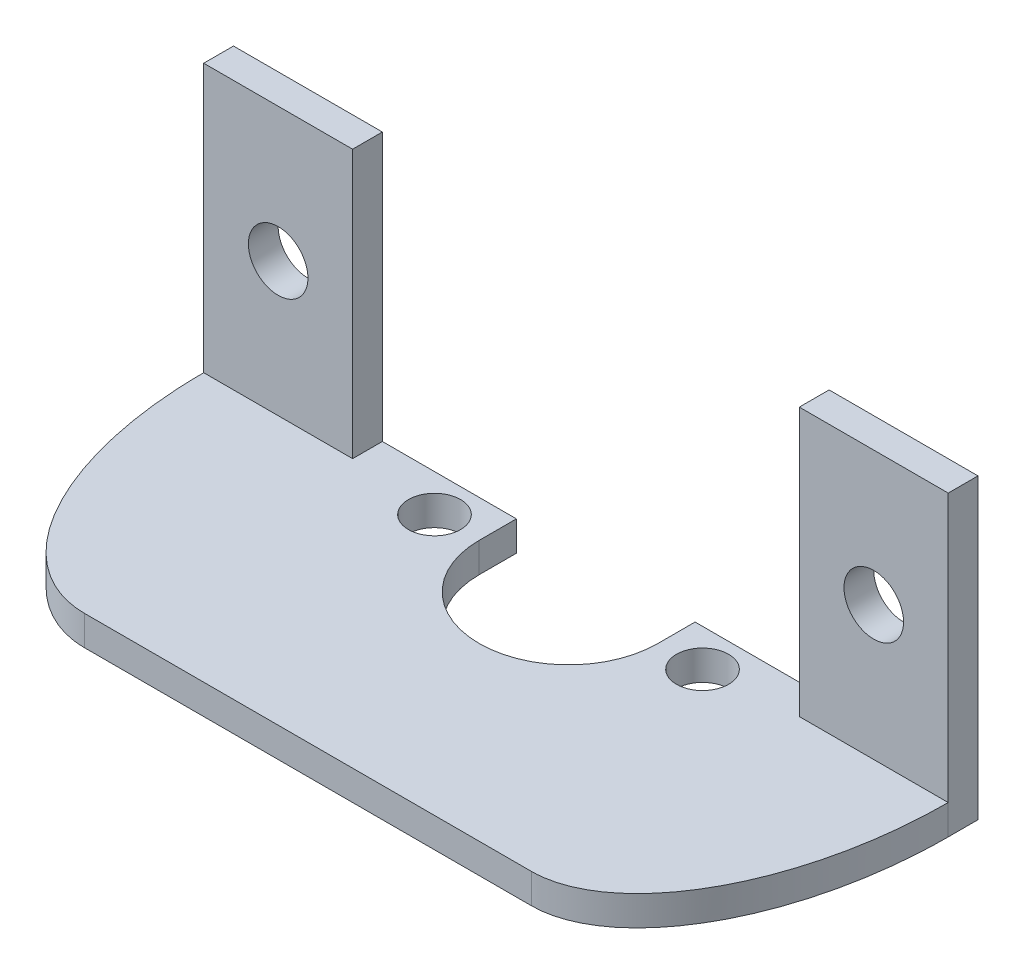
ISO-10303-21;
HEADER;
FILE_DESCRIPTION(('STEP AP214'),'2;1');
FILE_NAME('part.step','',(''),(''),'','','');
FILE_SCHEMA(('AUTOMOTIVE_DESIGN { 1 0 10303 214 1 1 1 1 }'));
ENDSEC;
DATA;
#1=APPLICATION_CONTEXT('core data for automotive mechanical design processes');
#2=APPLICATION_PROTOCOL_DEFINITION('international standard','automotive_design',2000,#1);
#3=PRODUCT_CONTEXT('',#1,'mechanical');
#4=PRODUCT('Part','Part','',(#3));
#5=PRODUCT_RELATED_PRODUCT_CATEGORY('part','',(#4));
#6=PRODUCT_DEFINITION_FORMATION('','',#4);
#7=PRODUCT_DEFINITION_CONTEXT('part definition',#1,'design');
#8=PRODUCT_DEFINITION('design','',#6,#7);
#9=PRODUCT_DEFINITION_SHAPE('','',#8);
#10=(LENGTH_UNIT() NAMED_UNIT(*) SI_UNIT(.MILLI.,.METRE.));
#11=(NAMED_UNIT(*) PLANE_ANGLE_UNIT() SI_UNIT($,.RADIAN.));
#12=(NAMED_UNIT(*) SI_UNIT($,.STERADIAN.) SOLID_ANGLE_UNIT());
#13=UNCERTAINTY_MEASURE_WITH_UNIT(LENGTH_MEASURE(1.E-05),#10,'distance_accuracy_value','');
#14=(GEOMETRIC_REPRESENTATION_CONTEXT(3) GLOBAL_UNCERTAINTY_ASSIGNED_CONTEXT((#13)) GLOBAL_UNIT_ASSIGNED_CONTEXT((#10,
#11,#12)) REPRESENTATION_CONTEXT('',''));
#15=CARTESIAN_POINT('',(0.,0.,0.));
#16=DIRECTION('',(0.,0.,1.));
#17=DIRECTION('',(1.,0.,0.));
#18=AXIS2_PLACEMENT_3D('',#15,#16,#17);
#19=CARTESIAN_POINT('',(-25.,2.,-10.));
#20=DIRECTION('',(0.,0.,1.));
#21=DIRECTION('',(1.,0.,0.));
#22=AXIS2_PLACEMENT_3D('',#19,#20,#21);
#23=PLANE('',#22);
#24=CARTESIAN_POINT('',(-20.,11.,-10.));
#25=DIRECTION('',(0.,0.,1.));
#26=DIRECTION('',(1.,0.,0.));
#27=AXIS2_PLACEMENT_3D('',#24,#25,#26);
#28=CIRCLE('',#27,2.);
#29=CARTESIAN_POINT('',(-18.,11.,-10.));
#30=VERTEX_POINT('',#29);
#31=EDGE_CURVE('E469',#30,#30,#28,.T.);
#32=ORIENTED_EDGE('',*,*,#31,.T.);
#33=EDGE_LOOP('',(#32));
#34=FACE_BOUND('',#33,.T.);
#35=DIRECTION('',(-1.,0.,0.));
#36=VECTOR('',#35,1.);
#37=CARTESIAN_POINT('',(-25.,2.,-10.));
#38=LINE('',#37,#36);
#39=CARTESIAN_POINT('',(-6.,2.,-10.));
#40=VERTEX_POINT('',#39);
#41=CARTESIAN_POINT('',(-15.,2.,-10.));
#42=VERTEX_POINT('',#41);
#43=EDGE_CURVE('E237',#40,#42,#38,.T.);
#44=ORIENTED_EDGE('',*,*,#43,.F.);
#45=DIRECTION('',(0.,1.,0.));
#46=VECTOR('',#45,1.);
#47=CARTESIAN_POINT('',(-6.,-0.0899999999999998,-10.));
#48=LINE('',#47,#46);
#49=CARTESIAN_POINT('',(-6.,0.,-10.));
#50=VERTEX_POINT('',#49);
#51=EDGE_CURVE('E194',#50,#40,#48,.T.);
#52=ORIENTED_EDGE('',*,*,#51,.F.);
#53=DIRECTION('',(-1.,0.,0.));
#54=VECTOR('',#53,1.);
#55=CARTESIAN_POINT('',(-25.,0.,-10.));
#56=LINE('',#55,#54);
#57=CARTESIAN_POINT('',(-25.,0.,-10.));
#58=VERTEX_POINT('',#57);
#59=EDGE_CURVE('E408',#50,#58,#56,.T.);
#60=ORIENTED_EDGE('',*,*,#59,.T.);
#61=DIRECTION('',(0.,-1.,0.));
#62=VECTOR('',#61,1.);
#63=CARTESIAN_POINT('',(-25.,2.,-10.));
#64=LINE('',#63,#62);
#65=CARTESIAN_POINT('',(-25.,20.,-10.));
#66=VERTEX_POINT('',#65);
#67=EDGE_CURVE('E245',#66,#58,#64,.T.);
#68=ORIENTED_EDGE('',*,*,#67,.F.);
#69=DIRECTION('',(-1.,0.,0.));
#70=VECTOR('',#69,1.);
#71=CARTESIAN_POINT('',(-25.,20.,-10.));
#72=LINE('',#71,#70);
#73=CARTESIAN_POINT('',(-15.,20.,-10.));
#74=VERTEX_POINT('',#73);
#75=EDGE_CURVE('E223',#74,#66,#72,.T.);
#76=ORIENTED_EDGE('',*,*,#75,.F.);
#77=DIRECTION('',(0.,-1.,0.));
#78=VECTOR('',#77,1.);
#79=CARTESIAN_POINT('',(-15.,20.,-10.));
#80=LINE('',#79,#78);
#81=EDGE_CURVE('E226',#74,#42,#80,.T.);
#82=ORIENTED_EDGE('',*,*,#81,.T.);
#83=EDGE_LOOP('',(#44,#52,#60,#68,#76,#82));
#84=FACE_BOUND('',#83,.T.);
#85=ADVANCED_FACE('F50',(#34,#84),#23,.F.);
#86=CARTESIAN_POINT('',(0.,2.,0.));
#87=DIRECTION('',(0.,1.,0.));
#88=DIRECTION('',(0.,0.,1.));
#89=AXIS2_PLACEMENT_3D('',#86,#87,#88);
#90=PLANE('',#89);
#91=CARTESIAN_POINT('',(-9.,2.,-7.5));
#92=DIRECTION('',(0.,1.,0.));
#93=DIRECTION('',(0.,0.,1.));
#94=AXIS2_PLACEMENT_3D('',#91,#92,#93);
#95=CIRCLE('',#94,1.75);
#96=CARTESIAN_POINT('',(-9.,2.,-5.75));
#97=VERTEX_POINT('',#96);
#98=EDGE_CURVE('E459',#97,#97,#95,.T.);
#99=ORIENTED_EDGE('',*,*,#98,.F.);
#100=EDGE_LOOP('',(#99));
#101=FACE_BOUND('',#100,.T.);
#102=CARTESIAN_POINT('',(9.,2.,-7.5));
#103=DIRECTION('',(0.,1.,0.));
#104=DIRECTION('',(0.,0.,1.));
#105=AXIS2_PLACEMENT_3D('',#102,#103,#104);
#106=CIRCLE('',#105,1.75);
#107=CARTESIAN_POINT('',(9.,2.,-5.75));
#108=VERTEX_POINT('',#107);
#109=EDGE_CURVE('E464',#108,#108,#106,.T.);
#110=ORIENTED_EDGE('',*,*,#109,.F.);
#111=EDGE_LOOP('',(#110));
#112=FACE_BOUND('',#111,.T.);
#113=DIRECTION('',(0.,0.,1.));
#114=VECTOR('',#113,1.);
#115=CARTESIAN_POINT('',(-6.,2.,-7.5));
#116=LINE('',#115,#114);
#117=CARTESIAN_POINT('',(-6.,2.,-7.5));
#118=VERTEX_POINT('',#117);
#119=EDGE_CURVE('E172',#40,#118,#116,.T.);
#120=ORIENTED_EDGE('',*,*,#119,.F.);
#121=ORIENTED_EDGE('',*,*,#43,.T.);
#122=DIRECTION('',(0.,0.,-1.));
#123=VECTOR('',#122,1.);
#124=CARTESIAN_POINT('',(-15.,2.,-10.));
#125=LINE('',#124,#123);
#126=CARTESIAN_POINT('',(-15.,2.,-8.));
#127=VERTEX_POINT('',#126);
#128=EDGE_CURVE('E219',#127,#42,#125,.T.);
#129=ORIENTED_EDGE('',*,*,#128,.F.);
#130=DIRECTION('',(1.,0.,0.));
#131=VECTOR('',#130,1.);
#132=CARTESIAN_POINT('',(-25.,2.,-8.));
#133=LINE('',#132,#131);
#134=CARTESIAN_POINT('',(-25.,2.,-8.));
#135=VERTEX_POINT('',#134);
#136=EDGE_CURVE('E204',#135,#127,#133,.T.);
#137=ORIENTED_EDGE('',*,*,#136,.F.);
#138=CARTESIAN_POINT('',(-15.,2.,10.));
#139=CARTESIAN_POINT('',(-25.,2.,10.));
#140=CARTESIAN_POINT('',(-25.,2.,-7.99999999999999));
#141=(BOUNDED_CURVE() B_SPLINE_CURVE(2,(#138,#139,#140),.UNSPECIFIED.,.F.,
.F.) B_SPLINE_CURVE_WITH_KNOTS((3,3),(0.,1.),
.UNSPECIFIED.) CURVE() GEOMETRIC_REPRESENTATION_ITEM() RATIONAL_B_SPLINE_CURVE((1.,
0.707106781186548,1.)) REPRESENTATION_ITEM(''));
#142=CARTESIAN_POINT('',(-15.,2.,10.));
#143=VERTEX_POINT('',#142);
#144=EDGE_CURVE('E496',#135,#143,#141,.F.);
#145=ORIENTED_EDGE('',*,*,#144,.T.);
#146=DIRECTION('',(1.,0.,0.));
#147=VECTOR('',#146,1.);
#148=CARTESIAN_POINT('',(-25.,2.,10.));
#149=LINE('',#148,#147);
#150=CARTESIAN_POINT('',(15.,2.,10.));
#151=VERTEX_POINT('',#150);
#152=EDGE_CURVE('E236',#143,#151,#149,.T.);
#153=ORIENTED_EDGE('',*,*,#152,.T.);
#154=CARTESIAN_POINT('',(25.,2.,-8.));
#155=CARTESIAN_POINT('',(25.,2.,10.));
#156=CARTESIAN_POINT('',(15.,2.,10.));
#157=(BOUNDED_CURVE() B_SPLINE_CURVE(2,(#154,#155,#156),.UNSPECIFIED.,.F.,
.F.) B_SPLINE_CURVE_WITH_KNOTS((3,3),(0.,1.),
.UNSPECIFIED.) CURVE() GEOMETRIC_REPRESENTATION_ITEM() RATIONAL_B_SPLINE_CURVE((1.,
0.707106781186547,1.)) REPRESENTATION_ITEM(''));
#158=CARTESIAN_POINT('',(25.,2.,-8.));
#159=VERTEX_POINT('',#158);
#160=EDGE_CURVE('E291',#151,#159,#157,.F.);
#161=ORIENTED_EDGE('',*,*,#160,.T.);
#162=DIRECTION('',(1.,0.,0.));
#163=VECTOR('',#162,1.);
#164=CARTESIAN_POINT('',(25.,2.,-8.));
#165=LINE('',#164,#163);
#166=CARTESIAN_POINT('',(15.,2.,-8.));
#167=VERTEX_POINT('',#166);
#168=EDGE_CURVE('E205',#167,#159,#165,.T.);
#169=ORIENTED_EDGE('',*,*,#168,.F.);
#170=DIRECTION('',(0.,0.,1.));
#171=VECTOR('',#170,1.);
#172=CARTESIAN_POINT('',(15.,2.,-9.99999999999999));
#173=LINE('',#172,#171);
#174=CARTESIAN_POINT('',(15.,2.,-9.99999999999999));
#175=VERTEX_POINT('',#174);
#176=EDGE_CURVE('E201',#175,#167,#173,.T.);
#177=ORIENTED_EDGE('',*,*,#176,.F.);
#178=CARTESIAN_POINT('',(6.,2.,-10.));
#179=VERTEX_POINT('',#178);
#180=EDGE_CURVE('E187',#175,#179,#38,.T.);
#181=ORIENTED_EDGE('',*,*,#180,.T.);
#182=DIRECTION('',(0.,0.,-1.));
#183=VECTOR('',#182,1.);
#184=CARTESIAN_POINT('',(6.,2.,-10.));
#185=LINE('',#184,#183);
#186=CARTESIAN_POINT('',(6.,2.,-7.5));
#187=VERTEX_POINT('',#186);
#188=EDGE_CURVE('E168',#187,#179,#185,.T.);
#189=ORIENTED_EDGE('',*,*,#188,.F.);
#190=CARTESIAN_POINT('',(0.,2.,-7.5));
#191=DIRECTION('',(0.,1.,0.));
#192=DIRECTION('',(0.,0.,1.));
#193=AXIS2_PLACEMENT_3D('',#190,#191,#192);
#194=CIRCLE('',#193,6.);
#195=EDGE_CURVE('E175',#118,#187,#194,.T.);
#196=ORIENTED_EDGE('',*,*,#195,.F.);
#197=EDGE_LOOP('',(#120,#121,#129,#137,#145,#153,#161,#169,#177,#181,#189,#196));
#198=FACE_BOUND('',#197,.T.);
#199=ADVANCED_FACE('F184',(#101,#112,#198),#90,.T.);
#200=CARTESIAN_POINT('',(25.,2.,-10.));
#201=DIRECTION('',(-1.,0.,0.));
#202=DIRECTION('',(0.,0.,1.));
#203=AXIS2_PLACEMENT_3D('',#200,#201,#202);
#204=PLANE('',#203);
#205=DIRECTION('',(0.,-1.,0.));
#206=VECTOR('',#205,1.);
#207=CARTESIAN_POINT('',(25.,20.,-8.));
#208=LINE('',#207,#206);
#209=CARTESIAN_POINT('',(25.,20.,-8.));
#210=VERTEX_POINT('',#209);
#211=EDGE_CURVE('E200',#210,#159,#208,.T.);
#212=ORIENTED_EDGE('',*,*,#211,.T.);
#213=CARTESIAN_POINT('',(25.,-0.1,-8.));
#214=CARTESIAN_POINT('',(25.,0.633333333333333,-8.));
#215=CARTESIAN_POINT('',(25.,1.36666666666667,-8.));
#216=CARTESIAN_POINT('',(25.,2.1,-8.));
#217=(BOUNDED_CURVE() B_SPLINE_CURVE(3,(#213,#214,#215,#216),.UNSPECIFIED.,.F.,
.F.) B_SPLINE_CURVE_WITH_KNOTS((4,4),(-9.99999999999998E-05,0.0021),
.UNSPECIFIED.) CURVE() GEOMETRIC_REPRESENTATION_ITEM() RATIONAL_B_SPLINE_CURVE((1.,1.,1.,1.)) REPRESENTATION_ITEM(''));
#218=CARTESIAN_POINT('',(25.,0.,-8.));
#219=VERTEX_POINT('',#218);
#220=EDGE_CURVE('E414',#159,#219,#217,.F.);
#221=ORIENTED_EDGE('',*,*,#220,.T.);
#222=DIRECTION('',(0.,0.,-1.));
#223=VECTOR('',#222,1.);
#224=CARTESIAN_POINT('',(25.,0.,-10.));
#225=LINE('',#224,#223);
#226=CARTESIAN_POINT('',(25.,0.,-10.));
#227=VERTEX_POINT('',#226);
#228=EDGE_CURVE('E401',#219,#227,#225,.T.);
#229=ORIENTED_EDGE('',*,*,#228,.T.);
#230=DIRECTION('',(0.,-1.,0.));
#231=VECTOR('',#230,1.);
#232=CARTESIAN_POINT('',(25.,2.,-10.));
#233=LINE('',#232,#231);
#234=CARTESIAN_POINT('',(25.,20.,-10.));
#235=VERTEX_POINT('',#234);
#236=EDGE_CURVE('E520',#235,#227,#233,.T.);
#237=ORIENTED_EDGE('',*,*,#236,.F.);
#238=DIRECTION('',(0.,0.,-1.));
#239=VECTOR('',#238,1.);
#240=CARTESIAN_POINT('',(25.,20.,-10.));
#241=LINE('',#240,#239);
#242=EDGE_CURVE('E212',#210,#235,#241,.T.);
#243=ORIENTED_EDGE('',*,*,#242,.F.);
#244=EDGE_LOOP('',(#212,#221,#229,#237,#243));
#245=FACE_BOUND('',#244,.T.);
#246=ADVANCED_FACE('F305',(#245),#204,.F.);
#247=CARTESIAN_POINT('',(20.,11.,-10.));
#248=DIRECTION('',(0.,0.,1.));
#249=DIRECTION('',(1.,0.,0.));
#250=AXIS2_PLACEMENT_3D('',#247,#248,#249);
#251=CIRCLE('',#250,2.);
#252=CARTESIAN_POINT('',(22.,11.,-10.));
#253=VERTEX_POINT('',#252);
#254=EDGE_CURVE('E473',#253,#253,#251,.T.);
#255=ORIENTED_EDGE('',*,*,#254,.T.);
#256=EDGE_LOOP('',(#255));
#257=FACE_BOUND('',#256,.T.);
#258=CARTESIAN_POINT('',(6.,0.,-10.));
#259=VERTEX_POINT('',#258);
#260=EDGE_CURVE('E529',#227,#259,#56,.T.);
#261=ORIENTED_EDGE('',*,*,#260,.T.);
#262=DIRECTION('',(0.,1.,0.));
#263=VECTOR('',#262,1.);
#264=CARTESIAN_POINT('',(6.,-0.0899999999999998,-10.));
#265=LINE('',#264,#263);
#266=EDGE_CURVE('E71',#259,#179,#265,.T.);
#267=ORIENTED_EDGE('',*,*,#266,.T.);
#268=ORIENTED_EDGE('',*,*,#180,.F.);
#269=DIRECTION('',(0.,-1.,0.));
#270=VECTOR('',#269,1.);
#271=CARTESIAN_POINT('',(15.,20.,-9.99999999999999));
#272=LINE('',#271,#270);
#273=CARTESIAN_POINT('',(15.,20.,-9.99999999999999));
#274=VERTEX_POINT('',#273);
#275=EDGE_CURVE('E193',#274,#175,#272,.T.);
#276=ORIENTED_EDGE('',*,*,#275,.F.);
#277=DIRECTION('',(-1.,0.,0.));
#278=VECTOR('',#277,1.);
#279=CARTESIAN_POINT('',(25.,20.,-10.));
#280=LINE('',#279,#278);
#281=EDGE_CURVE('E210',#235,#274,#280,.T.);
#282=ORIENTED_EDGE('',*,*,#281,.F.);
#283=ORIENTED_EDGE('',*,*,#236,.T.);
#284=EDGE_LOOP('',(#261,#267,#268,#276,#282,#283));
#285=FACE_BOUND('',#284,.T.);
#286=ADVANCED_FACE('F577',(#257,#285),#23,.F.);
#287=CARTESIAN_POINT('',(-25.,2.,-10.));
#288=DIRECTION('',(1.,0.,0.));
#289=DIRECTION('',(0.,0.,-1.));
#290=AXIS2_PLACEMENT_3D('',#287,#288,#289);
#291=PLANE('',#290);
#292=DIRECTION('',(0.,0.,1.));
#293=VECTOR('',#292,1.);
#294=CARTESIAN_POINT('',(-25.,0.,-10.));
#295=LINE('',#294,#293);
#296=CARTESIAN_POINT('',(-25.,0.,-7.99999999999999));
#297=VERTEX_POINT('',#296);
#298=EDGE_CURVE('E258',#58,#297,#295,.T.);
#299=ORIENTED_EDGE('',*,*,#298,.T.);
#300=CARTESIAN_POINT('',(-25.,2.1,-7.99999999999999));
#301=CARTESIAN_POINT('',(-25.,1.36666666666667,-7.99999999999999));
#302=CARTESIAN_POINT('',(-25.,0.633333333333333,-7.99999999999999));
#303=CARTESIAN_POINT('',(-25.,-0.1,-7.99999999999999));
#304=(BOUNDED_CURVE() B_SPLINE_CURVE(3,(#300,#301,#302,#303),.UNSPECIFIED.,.F.,
.F.) B_SPLINE_CURVE_WITH_KNOTS((4,4),(-0.0001,0.0021),
.UNSPECIFIED.) CURVE() GEOMETRIC_REPRESENTATION_ITEM() RATIONAL_B_SPLINE_CURVE((1.,1.,1.,1.)) REPRESENTATION_ITEM(''));
#305=EDGE_CURVE('E512',#297,#135,#304,.F.);
#306=ORIENTED_EDGE('',*,*,#305,.T.);
#307=DIRECTION('',(0.,-1.,0.));
#308=VECTOR('',#307,1.);
#309=CARTESIAN_POINT('',(-25.,20.,-8.));
#310=LINE('',#309,#308);
#311=CARTESIAN_POINT('',(-25.,20.,-8.));
#312=VERTEX_POINT('',#311);
#313=EDGE_CURVE('E234',#312,#135,#310,.T.);
#314=ORIENTED_EDGE('',*,*,#313,.F.);
#315=DIRECTION('',(0.,0.,1.));
#316=VECTOR('',#315,1.);
#317=CARTESIAN_POINT('',(-25.,20.,-10.));
#318=LINE('',#317,#316);
#319=EDGE_CURVE('E215',#66,#312,#318,.T.);
#320=ORIENTED_EDGE('',*,*,#319,.F.);
#321=ORIENTED_EDGE('',*,*,#67,.T.);
#322=EDGE_LOOP('',(#299,#306,#314,#320,#321));
#323=FACE_BOUND('',#322,.T.);
#324=ADVANCED_FACE('F272',(#323),#291,.F.);
#325=CARTESIAN_POINT('',(-25.,2.,10.));
#326=DIRECTION('',(0.,0.,-1.));
#327=DIRECTION('',(-1.,0.,0.));
#328=AXIS2_PLACEMENT_3D('',#325,#326,#327);
#329=PLANE('',#328);
#330=DIRECTION('',(1.,0.,0.));
#331=VECTOR('',#330,1.);
#332=CARTESIAN_POINT('',(-25.,0.,10.));
#333=LINE('',#332,#331);
#334=CARTESIAN_POINT('',(-15.,0.,10.));
#335=VERTEX_POINT('',#334);
#336=CARTESIAN_POINT('',(15.,0.,10.));
#337=VERTEX_POINT('',#336);
#338=EDGE_CURVE('E246',#335,#337,#333,.T.);
#339=ORIENTED_EDGE('',*,*,#338,.T.);
#340=CARTESIAN_POINT('',(15.,2.1,10.));
#341=CARTESIAN_POINT('',(15.,1.36666666666667,10.));
#342=CARTESIAN_POINT('',(15.,0.633333333333333,10.));
#343=CARTESIAN_POINT('',(15.,-0.1,10.));
#344=(BOUNDED_CURVE() B_SPLINE_CURVE(3,(#340,#341,#342,#343),.UNSPECIFIED.,.F.,
.F.) B_SPLINE_CURVE_WITH_KNOTS((4,4),(-0.0001,0.0021),
.UNSPECIFIED.) CURVE() GEOMETRIC_REPRESENTATION_ITEM() RATIONAL_B_SPLINE_CURVE((1.,1.,1.,1.)) REPRESENTATION_ITEM(''));
#345=EDGE_CURVE('E79',#337,#151,#344,.F.);
#346=ORIENTED_EDGE('',*,*,#345,.T.);
#347=ORIENTED_EDGE('',*,*,#152,.F.);
#348=CARTESIAN_POINT('',(-15.,-0.1,10.));
#349=CARTESIAN_POINT('',(-15.,0.633333333333333,10.));
#350=CARTESIAN_POINT('',(-15.,1.36666666666667,10.));
#351=CARTESIAN_POINT('',(-15.,2.1,10.));
#352=(BOUNDED_CURVE() B_SPLINE_CURVE(3,(#348,#349,#350,#351),.UNSPECIFIED.,.F.,
.F.) B_SPLINE_CURVE_WITH_KNOTS((4,4),(-9.99999999999998E-05,0.0021),
.UNSPECIFIED.) CURVE() GEOMETRIC_REPRESENTATION_ITEM() RATIONAL_B_SPLINE_CURVE((1.,1.,1.,1.)) REPRESENTATION_ITEM(''));
#353=EDGE_CURVE('E252',#143,#335,#352,.F.);
#354=ORIENTED_EDGE('',*,*,#353,.T.);
#355=EDGE_LOOP('',(#339,#346,#347,#354));
#356=FACE_BOUND('',#355,.T.);
#357=ADVANCED_FACE('F261',(#356),#329,.F.);
#358=CARTESIAN_POINT('',(0.,0.,0.));
#359=DIRECTION('',(0.,1.,0.));
#360=DIRECTION('',(0.,0.,1.));
#361=AXIS2_PLACEMENT_3D('',#358,#359,#360);
#362=PLANE('',#361);
#363=CARTESIAN_POINT('',(-9.,0.,-7.5));
#364=DIRECTION('',(0.,1.,0.));
#365=DIRECTION('',(0.,0.,1.));
#366=AXIS2_PLACEMENT_3D('',#363,#364,#365);
#367=CIRCLE('',#366,1.75);
#368=CARTESIAN_POINT('',(-9.,0.,-5.75));
#369=VERTEX_POINT('',#368);
#370=EDGE_CURVE('E58',#369,#369,#367,.T.);
#371=ORIENTED_EDGE('',*,*,#370,.T.);
#372=EDGE_LOOP('',(#371));
#373=FACE_BOUND('',#372,.T.);
#374=CARTESIAN_POINT('',(9.,0.,-7.5));
#375=DIRECTION('',(0.,1.,0.));
#376=DIRECTION('',(0.,0.,1.));
#377=AXIS2_PLACEMENT_3D('',#374,#375,#376);
#378=CIRCLE('',#377,1.75);
#379=CARTESIAN_POINT('',(9.,0.,-5.75));
#380=VERTEX_POINT('',#379);
#381=EDGE_CURVE('E457',#380,#380,#378,.T.);
#382=ORIENTED_EDGE('',*,*,#381,.T.);
#383=EDGE_LOOP('',(#382));
#384=FACE_BOUND('',#383,.T.);
#385=ORIENTED_EDGE('',*,*,#59,.F.);
#386=DIRECTION('',(0.,0.,1.));
#387=VECTOR('',#386,1.);
#388=CARTESIAN_POINT('',(-6.00000000000001,0.,0.));
#389=LINE('',#388,#387);
#390=CARTESIAN_POINT('',(-6.,0.,-7.5));
#391=VERTEX_POINT('',#390);
#392=EDGE_CURVE('E12',#50,#391,#389,.T.);
#393=ORIENTED_EDGE('',*,*,#392,.T.);
#394=CARTESIAN_POINT('',(0.,0.,-7.5));
#395=DIRECTION('',(0.,1.,0.));
#396=DIRECTION('',(0.,0.,1.));
#397=AXIS2_PLACEMENT_3D('',#394,#395,#396);
#398=CIRCLE('',#397,6.);
#399=CARTESIAN_POINT('',(6.,0.,-7.5));
#400=VERTEX_POINT('',#399);
#401=EDGE_CURVE('E63',#391,#400,#398,.T.);
#402=ORIENTED_EDGE('',*,*,#401,.T.);
#403=DIRECTION('',(0.,0.,-1.));
#404=VECTOR('',#403,1.);
#405=CARTESIAN_POINT('',(5.99999999999999,0.,0.));
#406=LINE('',#405,#404);
#407=EDGE_CURVE('E169',#400,#259,#406,.T.);
#408=ORIENTED_EDGE('',*,*,#407,.T.);
#409=ORIENTED_EDGE('',*,*,#260,.F.);
#410=ORIENTED_EDGE('',*,*,#228,.F.);
#411=CARTESIAN_POINT('',(15.,0.,10.));
#412=CARTESIAN_POINT('',(25.,0.,10.));
#413=CARTESIAN_POINT('',(25.,0.,-8.));
#414=(BOUNDED_CURVE() B_SPLINE_CURVE(2,(#411,#412,#413),.UNSPECIFIED.,.F.,
.F.) B_SPLINE_CURVE_WITH_KNOTS((3,3),(0.,1.),
.UNSPECIFIED.) CURVE() GEOMETRIC_REPRESENTATION_ITEM() RATIONAL_B_SPLINE_CURVE((1.,
0.707106781186547,1.)) REPRESENTATION_ITEM(''));
#415=EDGE_CURVE('E431',#219,#337,#414,.F.);
#416=ORIENTED_EDGE('',*,*,#415,.T.);
#417=ORIENTED_EDGE('',*,*,#338,.F.);
#418=CARTESIAN_POINT('',(-25.,0.,-7.99999999999999));
#419=CARTESIAN_POINT('',(-25.,0.,10.));
#420=CARTESIAN_POINT('',(-15.,0.,10.));
#421=(BOUNDED_CURVE() B_SPLINE_CURVE(2,(#418,#419,#420),.UNSPECIFIED.,.F.,
.F.) B_SPLINE_CURVE_WITH_KNOTS((3,3),(0.,1.),
.UNSPECIFIED.) CURVE() GEOMETRIC_REPRESENTATION_ITEM() RATIONAL_B_SPLINE_CURVE((1.,
0.707106781186548,1.)) REPRESENTATION_ITEM(''));
#422=EDGE_CURVE('E324',#335,#297,#421,.F.);
#423=ORIENTED_EDGE('',*,*,#422,.T.);
#424=ORIENTED_EDGE('',*,*,#298,.F.);
#425=EDGE_LOOP('',(#385,#393,#402,#408,#409,#410,#416,#417,#423,#424));
#426=FACE_BOUND('',#425,.T.);
#427=ADVANCED_FACE('F271',(#373,#384,#426),#362,.F.);
#428=CARTESIAN_POINT('',(-25.,20.,-8.));
#429=DIRECTION('',(0.,0.,-1.));
#430=DIRECTION('',(-1.,0.,0.));
#431=AXIS2_PLACEMENT_3D('',#428,#429,#430);
#432=PLANE('',#431);
#433=CARTESIAN_POINT('',(-20.,11.,-7.99999999999999));
#434=DIRECTION('',(0.,0.,1.));
#435=DIRECTION('',(-1.,0.,0.));
#436=AXIS2_PLACEMENT_3D('',#433,#434,#435);
#437=CIRCLE('',#436,2.);
#438=CARTESIAN_POINT('',(-22.,11.,-7.99999999999999));
#439=VERTEX_POINT('',#438);
#440=EDGE_CURVE('E477',#439,#439,#437,.T.);
#441=ORIENTED_EDGE('',*,*,#440,.F.);
#442=EDGE_LOOP('',(#441));
#443=FACE_BOUND('',#442,.T.);
#444=ORIENTED_EDGE('',*,*,#136,.T.);
#445=DIRECTION('',(0.,-1.,0.));
#446=VECTOR('',#445,1.);
#447=CARTESIAN_POINT('',(-15.,20.,-8.));
#448=LINE('',#447,#446);
#449=CARTESIAN_POINT('',(-15.,20.,-8.));
#450=VERTEX_POINT('',#449);
#451=EDGE_CURVE('E231',#450,#127,#448,.T.);
#452=ORIENTED_EDGE('',*,*,#451,.F.);
#453=DIRECTION('',(1.,0.,0.));
#454=VECTOR('',#453,1.);
#455=CARTESIAN_POINT('',(-25.,20.,-8.));
#456=LINE('',#455,#454);
#457=EDGE_CURVE('E218',#312,#450,#456,.T.);
#458=ORIENTED_EDGE('',*,*,#457,.F.);
#459=ORIENTED_EDGE('',*,*,#313,.T.);
#460=EDGE_LOOP('',(#444,#452,#458,#459));
#461=FACE_BOUND('',#460,.T.);
#462=ADVANCED_FACE('F307',(#443,#461),#432,.F.);
#463=CARTESIAN_POINT('',(-15.,20.,-10.));
#464=DIRECTION('',(-1.,0.,0.));
#465=DIRECTION('',(0.,0.,1.));
#466=AXIS2_PLACEMENT_3D('',#463,#464,#465);
#467=PLANE('',#466);
#468=ORIENTED_EDGE('',*,*,#128,.T.);
#469=ORIENTED_EDGE('',*,*,#81,.F.);
#470=DIRECTION('',(0.,0.,-1.));
#471=VECTOR('',#470,1.);
#472=CARTESIAN_POINT('',(-15.,20.,-10.));
#473=LINE('',#472,#471);
#474=EDGE_CURVE('E221',#450,#74,#473,.T.);
#475=ORIENTED_EDGE('',*,*,#474,.F.);
#476=ORIENTED_EDGE('',*,*,#451,.T.);
#477=EDGE_LOOP('',(#468,#469,#475,#476));
#478=FACE_BOUND('',#477,.T.);
#479=ADVANCED_FACE('F542',(#478),#467,.F.);
#480=CARTESIAN_POINT('',(0.,20.,0.));
#481=DIRECTION('',(0.,1.,0.));
#482=DIRECTION('',(0.,0.,1.));
#483=AXIS2_PLACEMENT_3D('',#480,#481,#482);
#484=PLANE('',#483);
#485=ORIENTED_EDGE('',*,*,#319,.T.);
#486=ORIENTED_EDGE('',*,*,#457,.T.);
#487=ORIENTED_EDGE('',*,*,#474,.T.);
#488=ORIENTED_EDGE('',*,*,#75,.T.);
#489=EDGE_LOOP('',(#485,#486,#487,#488));
#490=FACE_BOUND('',#489,.T.);
#491=ADVANCED_FACE('F537',(#490),#484,.T.);
#492=CARTESIAN_POINT('',(15.,20.,-9.99999999999999));
#493=DIRECTION('',(1.,0.,0.));
#494=DIRECTION('',(0.,0.,-1.));
#495=AXIS2_PLACEMENT_3D('',#492,#493,#494);
#496=PLANE('',#495);
#497=ORIENTED_EDGE('',*,*,#176,.T.);
#498=DIRECTION('',(0.,-1.,0.));
#499=VECTOR('',#498,1.);
#500=CARTESIAN_POINT('',(15.,20.,-7.99999999999999));
#501=LINE('',#500,#499);
#502=CARTESIAN_POINT('',(15.,20.,-7.99999999999999));
#503=VERTEX_POINT('',#502);
#504=EDGE_CURVE('E198',#503,#167,#501,.T.);
#505=ORIENTED_EDGE('',*,*,#504,.F.);
#506=DIRECTION('',(0.,0.,1.));
#507=VECTOR('',#506,1.);
#508=CARTESIAN_POINT('',(15.,20.,-9.99999999999999));
#509=LINE('',#508,#507);
#510=EDGE_CURVE('E208',#274,#503,#509,.T.);
#511=ORIENTED_EDGE('',*,*,#510,.F.);
#512=ORIENTED_EDGE('',*,*,#275,.T.);
#513=EDGE_LOOP('',(#497,#505,#511,#512));
#514=FACE_BOUND('',#513,.T.);
#515=ADVANCED_FACE('F489',(#514),#496,.F.);
#516=CARTESIAN_POINT('',(25.,20.,-8.));
#517=DIRECTION('',(0.,0.,-1.));
#518=DIRECTION('',(-1.,0.,0.));
#519=AXIS2_PLACEMENT_3D('',#516,#517,#518);
#520=PLANE('',#519);
#521=CARTESIAN_POINT('',(20.,11.,-7.99999999999999));
#522=DIRECTION('',(0.,0.,1.));
#523=DIRECTION('',(1.,0.,0.));
#524=AXIS2_PLACEMENT_3D('',#521,#522,#523);
#525=CIRCLE('',#524,2.);
#526=CARTESIAN_POINT('',(22.,11.,-7.99999999999999));
#527=VERTEX_POINT('',#526);
#528=EDGE_CURVE('E476',#527,#527,#525,.T.);
#529=ORIENTED_EDGE('',*,*,#528,.F.);
#530=EDGE_LOOP('',(#529));
#531=FACE_BOUND('',#530,.T.);
#532=ORIENTED_EDGE('',*,*,#168,.T.);
#533=ORIENTED_EDGE('',*,*,#211,.F.);
#534=DIRECTION('',(1.,0.,0.));
#535=VECTOR('',#534,1.);
#536=CARTESIAN_POINT('',(25.,20.,-8.));
#537=LINE('',#536,#535);
#538=EDGE_CURVE('E206',#503,#210,#537,.T.);
#539=ORIENTED_EDGE('',*,*,#538,.F.);
#540=ORIENTED_EDGE('',*,*,#504,.T.);
#541=EDGE_LOOP('',(#532,#533,#539,#540));
#542=FACE_BOUND('',#541,.T.);
#543=ADVANCED_FACE('F486',(#531,#542),#520,.F.);
#544=CARTESIAN_POINT('',(0.,20.,0.));
#545=DIRECTION('',(0.,-1.,0.));
#546=DIRECTION('',(0.,0.,-1.));
#547=AXIS2_PLACEMENT_3D('',#544,#545,#546);
#548=PLANE('',#547);
#549=ORIENTED_EDGE('',*,*,#242,.T.);
#550=ORIENTED_EDGE('',*,*,#281,.T.);
#551=ORIENTED_EDGE('',*,*,#510,.T.);
#552=ORIENTED_EDGE('',*,*,#538,.T.);
#553=EDGE_LOOP('',(#549,#550,#551,#552));
#554=FACE_BOUND('',#553,.T.);
#555=ADVANCED_FACE('F343',(#554),#548,.F.);
#556=CARTESIAN_POINT('',(-15.,2.1,10.));
#557=CARTESIAN_POINT('',(-15.,1.36666666666667,10.));
#558=CARTESIAN_POINT('',(-15.,0.633333333333333,10.));
#559=CARTESIAN_POINT('',(-15.,-0.1,10.));
#560=CARTESIAN_POINT('',(-25.,2.1,10.));
#561=CARTESIAN_POINT('',(-25.,1.36666666666667,10.));
#562=CARTESIAN_POINT('',(-25.,0.633333333333333,10.));
#563=CARTESIAN_POINT('',(-25.,-0.1,10.));
#564=CARTESIAN_POINT('',(-25.,2.1,-7.99999999999999));
#565=CARTESIAN_POINT('',(-25.,1.36666666666667,-7.99999999999999));
#566=CARTESIAN_POINT('',(-25.,0.633333333333333,-7.99999999999999));
#567=CARTESIAN_POINT('',(-25.,-0.1,-7.99999999999999));
#568=(BOUNDED_SURFACE() B_SPLINE_SURFACE(2,3,((#556,#557,#558,#559),(#560,#561,#562,#563),(#564,
#565,#566,#567)),.UNSPECIFIED.,.F.,.F.,.F.) B_SPLINE_SURFACE_WITH_KNOTS((3,3),(4,4),(0.,1.),
(-0.0001,0.0021),.UNSPECIFIED.) GEOMETRIC_REPRESENTATION_ITEM() RATIONAL_B_SPLINE_SURFACE(((1.,
1.,1.,1.),(0.707106781186548,0.707106781186548,0.707106781186548,0.707106781186548),(1.,1.,1.,1.))) REPRESENTATION_ITEM('') SURFACE());
#569=ORIENTED_EDGE('',*,*,#144,.F.);
#570=ORIENTED_EDGE('',*,*,#305,.F.);
#571=ORIENTED_EDGE('',*,*,#422,.F.);
#572=ORIENTED_EDGE('',*,*,#353,.F.);
#573=EDGE_LOOP('',(#569,#570,#571,#572));
#574=FACE_BOUND('',#573,.T.);
#575=ADVANCED_FACE('F330',(#574),#568,.T.);
#576=CARTESIAN_POINT('',(25.,2.1,-8.));
#577=CARTESIAN_POINT('',(25.,1.36666666666667,-8.));
#578=CARTESIAN_POINT('',(25.,0.633333333333333,-8.));
#579=CARTESIAN_POINT('',(25.,-0.1,-8.));
#580=CARTESIAN_POINT('',(25.,2.1,10.));
#581=CARTESIAN_POINT('',(25.,1.36666666666667,10.));
#582=CARTESIAN_POINT('',(25.,0.633333333333333,10.));
#583=CARTESIAN_POINT('',(25.,-0.1,10.));
#584=CARTESIAN_POINT('',(15.,2.1,10.));
#585=CARTESIAN_POINT('',(15.,1.36666666666667,10.));
#586=CARTESIAN_POINT('',(15.,0.633333333333333,10.));
#587=CARTESIAN_POINT('',(15.,-0.1,10.));
#588=(BOUNDED_SURFACE() B_SPLINE_SURFACE(2,3,((#576,#577,#578,#579),(#580,#581,#582,#583),(#584,
#585,#586,#587)),.UNSPECIFIED.,.F.,.F.,.F.) B_SPLINE_SURFACE_WITH_KNOTS((3,3),(4,4),(0.,1.),
(-0.0001,0.0021),.UNSPECIFIED.) GEOMETRIC_REPRESENTATION_ITEM() RATIONAL_B_SPLINE_SURFACE(((1.,
1.,1.,1.),(0.707106781186547,0.707106781186547,0.707106781186547,0.707106781186547),(1.,1.,1.,1.))) REPRESENTATION_ITEM('') SURFACE());
#589=ORIENTED_EDGE('',*,*,#160,.F.);
#590=ORIENTED_EDGE('',*,*,#345,.F.);
#591=ORIENTED_EDGE('',*,*,#415,.F.);
#592=ORIENTED_EDGE('',*,*,#220,.F.);
#593=EDGE_LOOP('',(#589,#590,#591,#592));
#594=FACE_BOUND('',#593,.T.);
#595=ADVANCED_FACE('F53',(#594),#588,.T.);
#596=CARTESIAN_POINT('',(0.,-0.0899999999999998,-7.5));
#597=DIRECTION('',(0.,1.,0.));
#598=DIRECTION('',(0.,0.,1.));
#599=AXIS2_PLACEMENT_3D('',#596,#597,#598);
#600=CYLINDRICAL_SURFACE('',#599,6.);
#601=DIRECTION('',(0.,1.,0.));
#602=VECTOR('',#601,1.);
#603=CARTESIAN_POINT('',(-6.,-0.0899999999999998,-7.5));
#604=LINE('',#603,#602);
#605=EDGE_CURVE('E178',#391,#118,#604,.T.);
#606=ORIENTED_EDGE('',*,*,#605,.T.);
#607=ORIENTED_EDGE('',*,*,#195,.T.);
#608=DIRECTION('',(0.,1.,0.));
#609=VECTOR('',#608,1.);
#610=CARTESIAN_POINT('',(6.,-0.0899999999999998,-7.5));
#611=LINE('',#610,#609);
#612=EDGE_CURVE('E164',#400,#187,#611,.T.);
#613=ORIENTED_EDGE('',*,*,#612,.F.);
#614=ORIENTED_EDGE('',*,*,#401,.F.);
#615=EDGE_LOOP('',(#606,#607,#613,#614));
#616=FACE_BOUND('',#615,.T.);
#617=ADVANCED_FACE('F176',(#616),#600,.F.);
#618=CARTESIAN_POINT('',(-6.,-0.0899999999999998,-7.5));
#619=DIRECTION('',(-1.,0.,0.));
#620=DIRECTION('',(0.,0.,1.));
#621=AXIS2_PLACEMENT_3D('',#618,#619,#620);
#622=PLANE('',#621);
#623=ORIENTED_EDGE('',*,*,#51,.T.);
#624=ORIENTED_EDGE('',*,*,#119,.T.);
#625=ORIENTED_EDGE('',*,*,#605,.F.);
#626=ORIENTED_EDGE('',*,*,#392,.F.);
#627=EDGE_LOOP('',(#623,#624,#625,#626));
#628=FACE_BOUND('',#627,.T.);
#629=ADVANCED_FACE('F602',(#628),#622,.F.);
#630=CARTESIAN_POINT('',(6.,-0.0899999999999998,-10.));
#631=DIRECTION('',(1.,0.,0.));
#632=DIRECTION('',(0.,0.,-1.));
#633=AXIS2_PLACEMENT_3D('',#630,#631,#632);
#634=PLANE('',#633);
#635=ORIENTED_EDGE('',*,*,#612,.T.);
#636=ORIENTED_EDGE('',*,*,#188,.T.);
#637=ORIENTED_EDGE('',*,*,#266,.F.);
#638=ORIENTED_EDGE('',*,*,#407,.F.);
#639=EDGE_LOOP('',(#635,#636,#637,#638));
#640=FACE_BOUND('',#639,.T.);
#641=ADVANCED_FACE('F166',(#640),#634,.F.);
#642=CARTESIAN_POINT('',(9.,-0.0899999999999998,-7.5));
#643=DIRECTION('',(0.,1.,0.));
#644=DIRECTION('',(0.,0.,1.));
#645=AXIS2_PLACEMENT_3D('',#642,#643,#644);
#646=CYLINDRICAL_SURFACE('',#645,1.75);
#647=ORIENTED_EDGE('',*,*,#109,.T.);
#648=EDGE_LOOP('',(#647));
#649=FACE_BOUND('',#648,.T.);
#650=ORIENTED_EDGE('',*,*,#381,.F.);
#651=EDGE_LOOP('',(#650));
#652=FACE_BOUND('',#651,.T.);
#653=ADVANCED_FACE('F596',(#649,#652),#646,.F.);
#654=CARTESIAN_POINT('',(-9.,-0.0899999999999998,-7.5));
#655=DIRECTION('',(0.,1.,0.));
#656=DIRECTION('',(0.,0.,1.));
#657=AXIS2_PLACEMENT_3D('',#654,#655,#656);
#658=CYLINDRICAL_SURFACE('',#657,1.75);
#659=ORIENTED_EDGE('',*,*,#98,.T.);
#660=EDGE_LOOP('',(#659));
#661=FACE_BOUND('',#660,.T.);
#662=ORIENTED_EDGE('',*,*,#370,.F.);
#663=EDGE_LOOP('',(#662));
#664=FACE_BOUND('',#663,.T.);
#665=ADVANCED_FACE('F589',(#661,#664),#658,.F.);
#666=CARTESIAN_POINT('',(20.,11.,-10.000025));
#667=DIRECTION('',(0.,0.,1.));
#668=DIRECTION('',(1.,0.,0.));
#669=AXIS2_PLACEMENT_3D('',#666,#667,#668);
#670=CYLINDRICAL_SURFACE('',#669,2.);
#671=ORIENTED_EDGE('',*,*,#528,.T.);
#672=EDGE_LOOP('',(#671));
#673=FACE_BOUND('',#672,.T.);
#674=ORIENTED_EDGE('',*,*,#254,.F.);
#675=EDGE_LOOP('',(#674));
#676=FACE_BOUND('',#675,.T.);
#677=ADVANCED_FACE('F483',(#673,#676),#670,.F.);
#678=CARTESIAN_POINT('',(-20.,11.,-10.000025));
#679=DIRECTION('',(0.,0.,1.));
#680=DIRECTION('',(1.,0.,0.));
#681=AXIS2_PLACEMENT_3D('',#678,#679,#680);
#682=CYLINDRICAL_SURFACE('',#681,2.);
#683=ORIENTED_EDGE('',*,*,#440,.T.);
#684=EDGE_LOOP('',(#683));
#685=FACE_BOUND('',#684,.T.);
#686=ORIENTED_EDGE('',*,*,#31,.F.);
#687=EDGE_LOOP('',(#686));
#688=FACE_BOUND('',#687,.T.);
#689=ADVANCED_FACE('F588',(#685,#688),#682,.F.);
#690=CLOSED_SHELL('',(#85,#199,#246,#286,#324,#357,#427,#462,#479,#491,#515,#543,#555,#575,#595,
#617,#629,#641,#653,#665,#677,#689));
#691=MANIFOLD_SOLID_BREP('B2',#690);
#692=ADVANCED_BREP_SHAPE_REPRESENTATION('',(#18,#691),#14);
#693=SHAPE_DEFINITION_REPRESENTATION(#9,#692);
ENDSEC;
END-ISO-10303-21;
